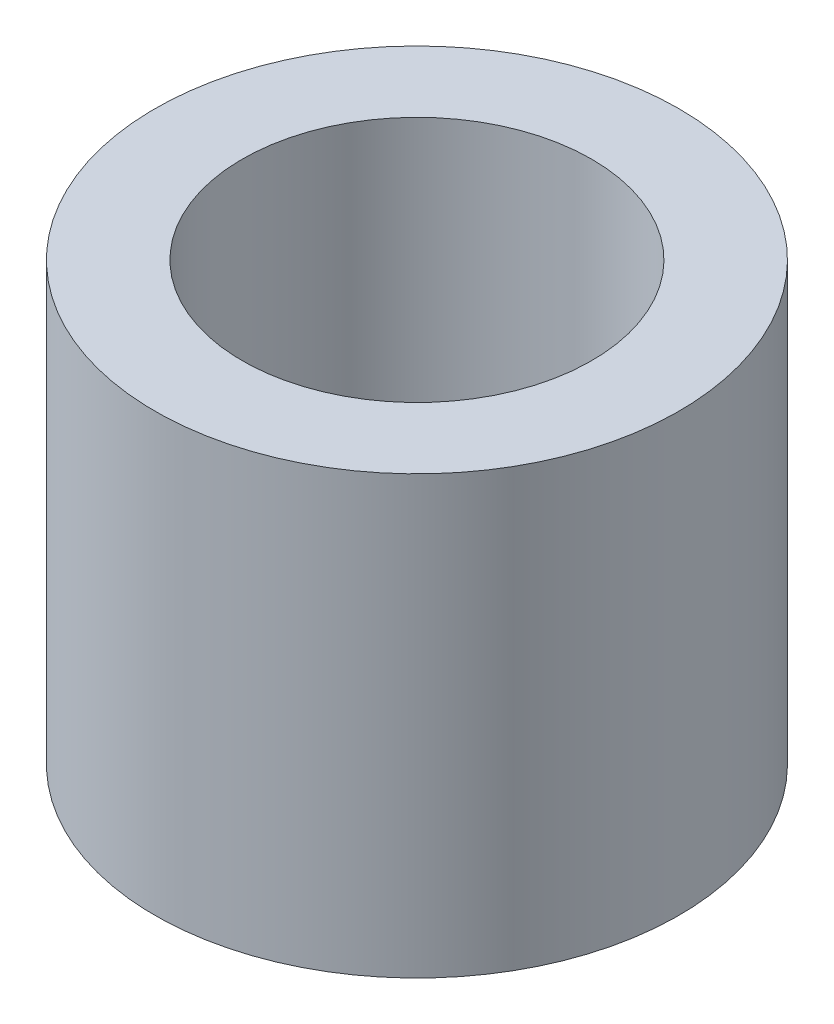
ISO-10303-21;
HEADER;
FILE_DESCRIPTION(('STEP AP214'),'2;1');
FILE_NAME('part.step','',(''),(''),'','','');
FILE_SCHEMA(('AUTOMOTIVE_DESIGN { 1 0 10303 214 1 1 1 1 }'));
ENDSEC;
DATA;
#1=APPLICATION_CONTEXT('core data for automotive mechanical design processes');
#2=APPLICATION_PROTOCOL_DEFINITION('international standard','automotive_design',2000,#1);
#3=PRODUCT_CONTEXT('',#1,'mechanical');
#4=PRODUCT('Part','Part','',(#3));
#5=PRODUCT_RELATED_PRODUCT_CATEGORY('part','',(#4));
#6=PRODUCT_DEFINITION_FORMATION('','',#4);
#7=PRODUCT_DEFINITION_CONTEXT('part definition',#1,'design');
#8=PRODUCT_DEFINITION('design','',#6,#7);
#9=PRODUCT_DEFINITION_SHAPE('','',#8);
#10=(LENGTH_UNIT() NAMED_UNIT(*) SI_UNIT(.MILLI.,.METRE.));
#11=(NAMED_UNIT(*) PLANE_ANGLE_UNIT() SI_UNIT($,.RADIAN.));
#12=(NAMED_UNIT(*) SI_UNIT($,.STERADIAN.) SOLID_ANGLE_UNIT());
#13=UNCERTAINTY_MEASURE_WITH_UNIT(LENGTH_MEASURE(1.E-05),#10,'distance_accuracy_value','');
#14=(GEOMETRIC_REPRESENTATION_CONTEXT(3) GLOBAL_UNCERTAINTY_ASSIGNED_CONTEXT((#13)) GLOBAL_UNIT_ASSIGNED_CONTEXT((#10,
#11,#12)) REPRESENTATION_CONTEXT('',''));
#15=CARTESIAN_POINT('',(0.,0.,0.));
#16=DIRECTION('',(0.,0.,1.));
#17=DIRECTION('',(1.,0.,0.));
#18=AXIS2_PLACEMENT_3D('',#15,#16,#17);
#19=CARTESIAN_POINT('',(0.,12.7,0.));
#20=DIRECTION('',(0.,1.,0.));
#21=DIRECTION('',(0.,0.,-1.));
#22=AXIS2_PLACEMENT_3D('',#19,#20,#21);
#23=PLANE('',#22);
#24=CARTESIAN_POINT('',(0.,12.7,0.));
#25=DIRECTION('',(0.,-1.,0.));
#26=DIRECTION('',(0.,0.,-1.));
#27=AXIS2_PLACEMENT_3D('',#24,#25,#26);
#28=CIRCLE('',#27,7.62);
#29=CARTESIAN_POINT('',(0.,12.7,-7.62));
#30=VERTEX_POINT('',#29);
#31=EDGE_CURVE('E10',#30,#30,#28,.T.);
#32=ORIENTED_EDGE('',*,*,#31,.F.);
#33=EDGE_LOOP('',(#32));
#34=FACE_BOUND('',#33,.T.);
#35=CARTESIAN_POINT('',(0.,12.7,0.));
#36=DIRECTION('',(0.,-1.,0.));
#37=DIRECTION('',(0.,0.,-1.));
#38=AXIS2_PLACEMENT_3D('',#35,#36,#37);
#39=CIRCLE('',#38,5.08);
#40=CARTESIAN_POINT('',(0.,12.7,-5.08));
#41=VERTEX_POINT('',#40);
#42=EDGE_CURVE('E50',#41,#41,#39,.T.);
#43=ORIENTED_EDGE('',*,*,#42,.T.);
#44=EDGE_LOOP('',(#43));
#45=FACE_BOUND('',#44,.T.);
#46=ADVANCED_FACE('F39',(#34,#45),#23,.T.);
#47=CARTESIAN_POINT('',(0.,0.,0.));
#48=DIRECTION('',(0.,1.,0.));
#49=DIRECTION('',(0.,0.,-1.));
#50=AXIS2_PLACEMENT_3D('',#47,#48,#49);
#51=PLANE('',#50);
#52=CARTESIAN_POINT('',(0.,0.,0.));
#53=DIRECTION('',(0.,-1.,0.));
#54=DIRECTION('',(0.,0.,-1.));
#55=AXIS2_PLACEMENT_3D('',#52,#53,#54);
#56=CIRCLE('',#55,7.62);
#57=CARTESIAN_POINT('',(0.,0.,-7.62));
#58=VERTEX_POINT('',#57);
#59=EDGE_CURVE('E43',#58,#58,#56,.T.);
#60=ORIENTED_EDGE('',*,*,#59,.T.);
#61=EDGE_LOOP('',(#60));
#62=FACE_BOUND('',#61,.T.);
#63=CARTESIAN_POINT('',(0.,0.,0.));
#64=DIRECTION('',(0.,-1.,0.));
#65=DIRECTION('',(0.,0.,-1.));
#66=AXIS2_PLACEMENT_3D('',#63,#64,#65);
#67=CIRCLE('',#66,5.08);
#68=CARTESIAN_POINT('',(0.,0.,-5.08));
#69=VERTEX_POINT('',#68);
#70=EDGE_CURVE('E52',#69,#69,#67,.T.);
#71=ORIENTED_EDGE('',*,*,#70,.F.);
#72=EDGE_LOOP('',(#71));
#73=FACE_BOUND('',#72,.T.);
#74=ADVANCED_FACE('F65',(#62,#73),#51,.F.);
#75=CARTESIAN_POINT('',(0.,12.7,0.));
#76=DIRECTION('',(0.,-1.,0.));
#77=DIRECTION('',(0.,0.,1.));
#78=AXIS2_PLACEMENT_3D('',#75,#76,#77);
#79=CYLINDRICAL_SURFACE('',#78,7.62);
#80=ORIENTED_EDGE('',*,*,#31,.T.);
#81=EDGE_LOOP('',(#80));
#82=FACE_BOUND('',#81,.T.);
#83=ORIENTED_EDGE('',*,*,#59,.F.);
#84=EDGE_LOOP('',(#83));
#85=FACE_BOUND('',#84,.T.);
#86=ADVANCED_FACE('F41',(#82,#85),#79,.T.);
#87=CARTESIAN_POINT('',(0.,12.7,0.));
#88=DIRECTION('',(0.,-1.,0.));
#89=DIRECTION('',(0.,0.,1.));
#90=AXIS2_PLACEMENT_3D('',#87,#88,#89);
#91=CYLINDRICAL_SURFACE('',#90,5.08);
#92=ORIENTED_EDGE('',*,*,#42,.F.);
#93=EDGE_LOOP('',(#92));
#94=FACE_BOUND('',#93,.T.);
#95=ORIENTED_EDGE('',*,*,#70,.T.);
#96=EDGE_LOOP('',(#95));
#97=FACE_BOUND('',#96,.T.);
#98=ADVANCED_FACE('F59',(#94,#97),#91,.F.);
#99=CLOSED_SHELL('',(#46,#74,#86,#98));
#100=MANIFOLD_SOLID_BREP('B2',#99);
#101=ADVANCED_BREP_SHAPE_REPRESENTATION('',(#18,#100),#14);
#102=SHAPE_DEFINITION_REPRESENTATION(#9,#101);
ENDSEC;
END-ISO-10303-21;
